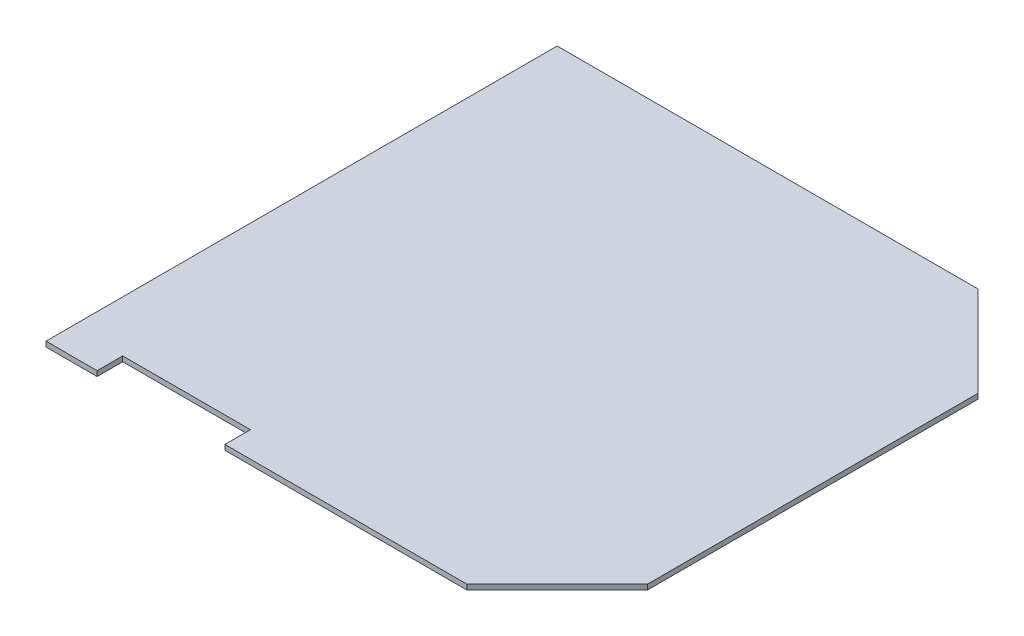
ISO-10303-21;
HEADER;
FILE_DESCRIPTION(('STEP AP214'),'2;1');
FILE_NAME('part.step','',(''),(''),'','','');
FILE_SCHEMA(('AUTOMOTIVE_DESIGN { 1 0 10303 214 1 1 1 1 }'));
ENDSEC;
DATA;
#1=APPLICATION_CONTEXT('core data for automotive mechanical design processes');
#2=APPLICATION_PROTOCOL_DEFINITION('international standard','automotive_design',2000,#1);
#3=PRODUCT_CONTEXT('',#1,'mechanical');
#4=PRODUCT('Part','Part','',(#3));
#5=PRODUCT_RELATED_PRODUCT_CATEGORY('part','',(#4));
#6=PRODUCT_DEFINITION_FORMATION('','',#4);
#7=PRODUCT_DEFINITION_CONTEXT('part definition',#1,'design');
#8=PRODUCT_DEFINITION('design','',#6,#7);
#9=PRODUCT_DEFINITION_SHAPE('','',#8);
#10=(LENGTH_UNIT() NAMED_UNIT(*) SI_UNIT(.MILLI.,.METRE.));
#11=(NAMED_UNIT(*) PLANE_ANGLE_UNIT() SI_UNIT($,.RADIAN.));
#12=(NAMED_UNIT(*) SI_UNIT($,.STERADIAN.) SOLID_ANGLE_UNIT());
#13=UNCERTAINTY_MEASURE_WITH_UNIT(LENGTH_MEASURE(1.E-05),#10,'distance_accuracy_value','');
#14=(GEOMETRIC_REPRESENTATION_CONTEXT(3) GLOBAL_UNCERTAINTY_ASSIGNED_CONTEXT((#13)) GLOBAL_UNIT_ASSIGNED_CONTEXT((#10,
#11,#12)) REPRESENTATION_CONTEXT('',''));
#15=CARTESIAN_POINT('',(0.,0.,0.));
#16=DIRECTION('',(0.,0.,1.));
#17=DIRECTION('',(1.,0.,0.));
#18=AXIS2_PLACEMENT_3D('',#15,#16,#17);
#19=CARTESIAN_POINT('',(-82.3223304703363,2.,100.));
#20=DIRECTION('',(0.,0.,-1.));
#21=DIRECTION('',(-1.,0.,0.));
#22=AXIS2_PLACEMENT_3D('',#19,#20,#21);
#23=PLANE('',#22);
#24=DIRECTION('',(1.,0.,0.));
#25=VECTOR('',#24,1.);
#26=CARTESIAN_POINT('',(-82.3223304703363,0.,100.));
#27=LINE('',#26,#25);
#28=CARTESIAN_POINT('',(-82.3223304703363,0.,100.));
#29=VERTEX_POINT('',#28);
#30=CARTESIAN_POINT('',(-62.3223304703363,0.,100.));
#31=VERTEX_POINT('',#30);
#32=EDGE_CURVE('E135',#29,#31,#27,.T.);
#33=ORIENTED_EDGE('',*,*,#32,.T.);
#34=DIRECTION('',(0.,1.,0.));
#35=VECTOR('',#34,1.);
#36=CARTESIAN_POINT('',(-62.3223304703363,0.,100.));
#37=LINE('',#36,#35);
#38=CARTESIAN_POINT('',(-62.3223304703363,2.,100.));
#39=VERTEX_POINT('',#38);
#40=EDGE_CURVE('E190',#31,#39,#37,.T.);
#41=ORIENTED_EDGE('',*,*,#40,.T.);
#42=DIRECTION('',(1.,0.,0.));
#43=VECTOR('',#42,1.);
#44=CARTESIAN_POINT('',(-82.3223304703363,2.,100.));
#45=LINE('',#44,#43);
#46=CARTESIAN_POINT('',(-82.3223304703363,2.,100.));
#47=VERTEX_POINT('',#46);
#48=EDGE_CURVE('E92',#47,#39,#45,.T.);
#49=ORIENTED_EDGE('',*,*,#48,.F.);
#50=DIRECTION('',(0.,-1.,0.));
#51=VECTOR('',#50,1.);
#52=CARTESIAN_POINT('',(-82.3223304703363,2.,100.));
#53=LINE('',#52,#51);
#54=EDGE_CURVE('E11',#47,#29,#53,.T.);
#55=ORIENTED_EDGE('',*,*,#54,.T.);
#56=EDGE_LOOP('',(#33,#41,#49,#55));
#57=FACE_BOUND('',#56,.T.);
#58=ADVANCED_FACE('F33',(#57),#23,.F.);
#59=CARTESIAN_POINT('',(-82.3223304703363,2.,100.));
#60=DIRECTION('',(1.,0.,0.));
#61=DIRECTION('',(0.,0.,-1.));
#62=AXIS2_PLACEMENT_3D('',#59,#60,#61);
#63=PLANE('',#62);
#64=DIRECTION('',(0.,0.,1.));
#65=VECTOR('',#64,1.);
#66=CARTESIAN_POINT('',(-82.3223304703363,0.,100.));
#67=LINE('',#66,#65);
#68=CARTESIAN_POINT('',(-82.3223304703363,0.,-100.));
#69=VERTEX_POINT('',#68);
#70=EDGE_CURVE('E130',#69,#29,#67,.T.);
#71=ORIENTED_EDGE('',*,*,#70,.T.);
#72=ORIENTED_EDGE('',*,*,#54,.F.);
#73=DIRECTION('',(0.,0.,1.));
#74=VECTOR('',#73,1.);
#75=CARTESIAN_POINT('',(-82.3223304703363,2.,100.));
#76=LINE('',#75,#74);
#77=CARTESIAN_POINT('',(-82.3223304703363,2.,-100.));
#78=VERTEX_POINT('',#77);
#79=EDGE_CURVE('E144',#78,#47,#76,.T.);
#80=ORIENTED_EDGE('',*,*,#79,.F.);
#81=DIRECTION('',(0.,-1.,0.));
#82=VECTOR('',#81,1.);
#83=CARTESIAN_POINT('',(-82.3223304703363,2.,-100.));
#84=LINE('',#83,#82);
#85=EDGE_CURVE('E126',#78,#69,#84,.T.);
#86=ORIENTED_EDGE('',*,*,#85,.T.);
#87=EDGE_LOOP('',(#71,#72,#80,#86));
#88=FACE_BOUND('',#87,.T.);
#89=ADVANCED_FACE('F35',(#88),#63,.F.);
#90=CARTESIAN_POINT('',(-12.3223304703363,2.,100.));
#91=VERTEX_POINT('',#90);
#92=CARTESIAN_POINT('',(82.3223304703364,2.,100.));
#93=VERTEX_POINT('',#92);
#94=EDGE_CURVE('E165',#91,#93,#45,.T.);
#95=ORIENTED_EDGE('',*,*,#94,.F.);
#96=DIRECTION('',(0.,1.,0.));
#97=VECTOR('',#96,1.);
#98=CARTESIAN_POINT('',(-12.3223304703363,0.,100.));
#99=LINE('',#98,#97);
#100=CARTESIAN_POINT('',(-12.3223304703363,0.,100.));
#101=VERTEX_POINT('',#100);
#102=EDGE_CURVE('E193',#101,#91,#99,.T.);
#103=ORIENTED_EDGE('',*,*,#102,.F.);
#104=CARTESIAN_POINT('',(82.3223304703364,0.,100.));
#105=VERTEX_POINT('',#104);
#106=EDGE_CURVE('E133',#101,#105,#27,.T.);
#107=ORIENTED_EDGE('',*,*,#106,.T.);
#108=DIRECTION('',(0.,-1.,0.));
#109=VECTOR('',#108,1.);
#110=CARTESIAN_POINT('',(82.3223304703364,2.,100.));
#111=LINE('',#110,#109);
#112=EDGE_CURVE('E41',#93,#105,#111,.T.);
#113=ORIENTED_EDGE('',*,*,#112,.F.);
#114=EDGE_LOOP('',(#95,#103,#107,#113));
#115=FACE_BOUND('',#114,.T.);
#116=ADVANCED_FACE('F198',(#115),#23,.F.);
#117=CARTESIAN_POINT('',(117.677669529664,2.,64.6446609406727));
#118=DIRECTION('',(-0.707106781186547,0.,-0.707106781186549));
#119=DIRECTION('',(-0.707106781186549,0.,0.707106781186546));
#120=AXIS2_PLACEMENT_3D('',#117,#118,#119);
#121=PLANE('',#120);
#122=DIRECTION('',(0.707106781186548,0.,-0.707106781186546));
#123=VECTOR('',#122,1.);
#124=CARTESIAN_POINT('',(117.677669529664,0.,64.6446609406727));
#125=LINE('',#124,#123);
#126=CARTESIAN_POINT('',(117.677669529664,0.,64.6446609406727));
#127=VERTEX_POINT('',#126);
#128=EDGE_CURVE('E138',#105,#127,#125,.T.);
#129=ORIENTED_EDGE('',*,*,#128,.T.);
#130=DIRECTION('',(0.,-1.,0.));
#131=VECTOR('',#130,1.);
#132=CARTESIAN_POINT('',(117.677669529664,2.,64.6446609406727));
#133=LINE('',#132,#131);
#134=CARTESIAN_POINT('',(117.677669529664,2.,64.6446609406727));
#135=VERTEX_POINT('',#134);
#136=EDGE_CURVE('E121',#135,#127,#133,.T.);
#137=ORIENTED_EDGE('',*,*,#136,.F.);
#138=DIRECTION('',(0.707106781186548,0.,-0.707106781186546));
#139=VECTOR('',#138,1.);
#140=CARTESIAN_POINT('',(117.677669529664,2.,64.6446609406727));
#141=LINE('',#140,#139);
#142=EDGE_CURVE('E109',#93,#135,#141,.T.);
#143=ORIENTED_EDGE('',*,*,#142,.F.);
#144=ORIENTED_EDGE('',*,*,#112,.T.);
#145=EDGE_LOOP('',(#129,#137,#143,#144));
#146=FACE_BOUND('',#145,.T.);
#147=ADVANCED_FACE('F151',(#146),#121,.F.);
#148=CARTESIAN_POINT('',(117.677669529664,2.,-64.6446609406727));
#149=DIRECTION('',(-1.,0.,0.));
#150=DIRECTION('',(0.,0.,1.));
#151=AXIS2_PLACEMENT_3D('',#148,#149,#150);
#152=PLANE('',#151);
#153=DIRECTION('',(0.,0.,-1.));
#154=VECTOR('',#153,1.);
#155=CARTESIAN_POINT('',(117.677669529664,0.,-64.6446609406727));
#156=LINE('',#155,#154);
#157=CARTESIAN_POINT('',(117.677669529664,0.,-64.6446609406727));
#158=VERTEX_POINT('',#157);
#159=EDGE_CURVE('E118',#127,#158,#156,.T.);
#160=ORIENTED_EDGE('',*,*,#159,.T.);
#161=DIRECTION('',(0.,-1.,0.));
#162=VECTOR('',#161,1.);
#163=CARTESIAN_POINT('',(117.677669529664,2.,-64.6446609406727));
#164=LINE('',#163,#162);
#165=CARTESIAN_POINT('',(117.677669529664,2.,-64.6446609406727));
#166=VERTEX_POINT('',#165);
#167=EDGE_CURVE('E115',#166,#158,#164,.T.);
#168=ORIENTED_EDGE('',*,*,#167,.F.);
#169=DIRECTION('',(0.,0.,-1.));
#170=VECTOR('',#169,1.);
#171=CARTESIAN_POINT('',(117.677669529664,2.,-64.6446609406727));
#172=LINE('',#171,#170);
#173=EDGE_CURVE('E102',#135,#166,#172,.T.);
#174=ORIENTED_EDGE('',*,*,#173,.F.);
#175=ORIENTED_EDGE('',*,*,#136,.T.);
#176=EDGE_LOOP('',(#160,#168,#174,#175));
#177=FACE_BOUND('',#176,.T.);
#178=ADVANCED_FACE('F116',(#177),#152,.F.);
#179=CARTESIAN_POINT('',(82.3223304703363,2.,-100.));
#180=DIRECTION('',(-0.707106781186546,0.,0.707106781186549));
#181=DIRECTION('',(0.707106781186549,0.,0.707106781186546));
#182=AXIS2_PLACEMENT_3D('',#179,#180,#181);
#183=PLANE('',#182);
#184=DIRECTION('',(-0.707106781186549,0.,-0.707106781186546));
#185=VECTOR('',#184,1.);
#186=CARTESIAN_POINT('',(82.3223304703363,0.,-100.));
#187=LINE('',#186,#185);
#188=CARTESIAN_POINT('',(82.3223304703363,0.,-100.));
#189=VERTEX_POINT('',#188);
#190=EDGE_CURVE('E141',#158,#189,#187,.T.);
#191=ORIENTED_EDGE('',*,*,#190,.T.);
#192=DIRECTION('',(0.,-1.,0.));
#193=VECTOR('',#192,1.);
#194=CARTESIAN_POINT('',(82.3223304703363,2.,-100.));
#195=LINE('',#194,#193);
#196=CARTESIAN_POINT('',(82.3223304703363,2.,-100.));
#197=VERTEX_POINT('',#196);
#198=EDGE_CURVE('E122',#197,#189,#195,.T.);
#199=ORIENTED_EDGE('',*,*,#198,.F.);
#200=DIRECTION('',(-0.707106781186549,0.,-0.707106781186546));
#201=VECTOR('',#200,1.);
#202=CARTESIAN_POINT('',(82.3223304703363,2.,-100.));
#203=LINE('',#202,#201);
#204=EDGE_CURVE('E106',#166,#197,#203,.T.);
#205=ORIENTED_EDGE('',*,*,#204,.F.);
#206=ORIENTED_EDGE('',*,*,#167,.T.);
#207=EDGE_LOOP('',(#191,#199,#205,#206));
#208=FACE_BOUND('',#207,.T.);
#209=ADVANCED_FACE('F124',(#208),#183,.F.);
#210=CARTESIAN_POINT('',(-82.3223304703363,2.,-100.));
#211=DIRECTION('',(0.,0.,1.));
#212=DIRECTION('',(1.,0.,0.));
#213=AXIS2_PLACEMENT_3D('',#210,#211,#212);
#214=PLANE('',#213);
#215=DIRECTION('',(-1.,0.,0.));
#216=VECTOR('',#215,1.);
#217=CARTESIAN_POINT('',(-82.3223304703363,0.,-100.));
#218=LINE('',#217,#216);
#219=EDGE_CURVE('E84',#189,#69,#218,.T.);
#220=ORIENTED_EDGE('',*,*,#219,.T.);
#221=ORIENTED_EDGE('',*,*,#85,.F.);
#222=DIRECTION('',(-1.,0.,0.));
#223=VECTOR('',#222,1.);
#224=CARTESIAN_POINT('',(-82.3223304703363,2.,-100.));
#225=LINE('',#224,#223);
#226=EDGE_CURVE('E57',#197,#78,#225,.T.);
#227=ORIENTED_EDGE('',*,*,#226,.F.);
#228=ORIENTED_EDGE('',*,*,#198,.T.);
#229=EDGE_LOOP('',(#220,#221,#227,#228));
#230=FACE_BOUND('',#229,.T.);
#231=ADVANCED_FACE('F161',(#230),#214,.F.);
#232=CARTESIAN_POINT('',(0.,2.,0.));
#233=DIRECTION('',(0.,-1.,0.));
#234=DIRECTION('',(0.,0.,-1.));
#235=AXIS2_PLACEMENT_3D('',#232,#233,#234);
#236=PLANE('',#235);
#237=ORIENTED_EDGE('',*,*,#48,.T.);
#238=DIRECTION('',(0.,0.,-1.));
#239=VECTOR('',#238,1.);
#240=CARTESIAN_POINT('',(-62.3223304703363,2.,0.));
#241=LINE('',#240,#239);
#242=CARTESIAN_POINT('',(-62.3223304703363,2.,90.));
#243=VERTEX_POINT('',#242);
#244=EDGE_CURVE('E134',#39,#243,#241,.T.);
#245=ORIENTED_EDGE('',*,*,#244,.T.);
#246=DIRECTION('',(1.,0.,0.));
#247=VECTOR('',#246,1.);
#248=CARTESIAN_POINT('',(0.,2.,90.));
#249=LINE('',#248,#247);
#250=CARTESIAN_POINT('',(-12.3223304703363,2.,90.));
#251=VERTEX_POINT('',#250);
#252=EDGE_CURVE('E211',#243,#251,#249,.T.);
#253=ORIENTED_EDGE('',*,*,#252,.T.);
#254=DIRECTION('',(0.,0.,1.));
#255=VECTOR('',#254,1.);
#256=CARTESIAN_POINT('',(-12.3223304703363,2.,0.));
#257=LINE('',#256,#255);
#258=EDGE_CURVE('E209',#251,#91,#257,.T.);
#259=ORIENTED_EDGE('',*,*,#258,.T.);
#260=ORIENTED_EDGE('',*,*,#94,.T.);
#261=ORIENTED_EDGE('',*,*,#142,.T.);
#262=ORIENTED_EDGE('',*,*,#173,.T.);
#263=ORIENTED_EDGE('',*,*,#204,.T.);
#264=ORIENTED_EDGE('',*,*,#226,.T.);
#265=ORIENTED_EDGE('',*,*,#79,.T.);
#266=EDGE_LOOP('',(#237,#245,#253,#259,#260,#261,#262,#263,#264,#265));
#267=FACE_BOUND('',#266,.T.);
#268=ADVANCED_FACE('F104',(#267),#236,.F.);
#269=CARTESIAN_POINT('',(0.,0.,0.));
#270=DIRECTION('',(0.,-1.,0.));
#271=DIRECTION('',(0.,0.,-1.));
#272=AXIS2_PLACEMENT_3D('',#269,#270,#271);
#273=PLANE('',#272);
#274=DIRECTION('',(0.,0.,1.));
#275=VECTOR('',#274,1.);
#276=CARTESIAN_POINT('',(-62.3223304703363,0.,100.));
#277=LINE('',#276,#275);
#278=CARTESIAN_POINT('',(-62.3223304703363,0.,90.));
#279=VERTEX_POINT('',#278);
#280=EDGE_CURVE('E192',#279,#31,#277,.T.);
#281=ORIENTED_EDGE('',*,*,#280,.T.);
#282=ORIENTED_EDGE('',*,*,#32,.F.);
#283=ORIENTED_EDGE('',*,*,#70,.F.);
#284=ORIENTED_EDGE('',*,*,#219,.F.);
#285=ORIENTED_EDGE('',*,*,#190,.F.);
#286=ORIENTED_EDGE('',*,*,#159,.F.);
#287=ORIENTED_EDGE('',*,*,#128,.F.);
#288=ORIENTED_EDGE('',*,*,#106,.F.);
#289=DIRECTION('',(0.,0.,-1.));
#290=VECTOR('',#289,1.);
#291=CARTESIAN_POINT('',(-12.3223304703363,0.,100.));
#292=LINE('',#291,#290);
#293=CARTESIAN_POINT('',(-12.3223304703363,0.,90.));
#294=VERTEX_POINT('',#293);
#295=EDGE_CURVE('E195',#101,#294,#292,.T.);
#296=ORIENTED_EDGE('',*,*,#295,.T.);
#297=DIRECTION('',(-1.,0.,0.));
#298=VECTOR('',#297,1.);
#299=CARTESIAN_POINT('',(-62.3223304703363,0.,90.));
#300=LINE('',#299,#298);
#301=EDGE_CURVE('E48',#294,#279,#300,.T.);
#302=ORIENTED_EDGE('',*,*,#301,.T.);
#303=EDGE_LOOP('',(#281,#282,#283,#284,#285,#286,#287,#288,#296,#302));
#304=FACE_BOUND('',#303,.T.);
#305=ADVANCED_FACE('F157',(#304),#273,.T.);
#306=CARTESIAN_POINT('',(-62.3223304703363,0.,100.));
#307=DIRECTION('',(-1.,0.,0.));
#308=DIRECTION('',(0.,0.,1.));
#309=AXIS2_PLACEMENT_3D('',#306,#307,#308);
#310=PLANE('',#309);
#311=ORIENTED_EDGE('',*,*,#40,.F.);
#312=ORIENTED_EDGE('',*,*,#280,.F.);
#313=DIRECTION('',(0.,1.,0.));
#314=VECTOR('',#313,1.);
#315=CARTESIAN_POINT('',(-62.3223304703363,0.,90.));
#316=LINE('',#315,#314);
#317=EDGE_CURVE('E213',#279,#243,#316,.T.);
#318=ORIENTED_EDGE('',*,*,#317,.T.);
#319=ORIENTED_EDGE('',*,*,#244,.F.);
#320=EDGE_LOOP('',(#311,#312,#318,#319));
#321=FACE_BOUND('',#320,.T.);
#322=ADVANCED_FACE('F191',(#321),#310,.F.);
#323=CARTESIAN_POINT('',(-62.3223304703363,0.,90.));
#324=DIRECTION('',(0.,0.,-1.));
#325=DIRECTION('',(-1.,0.,0.));
#326=AXIS2_PLACEMENT_3D('',#323,#324,#325);
#327=PLANE('',#326);
#328=ORIENTED_EDGE('',*,*,#317,.F.);
#329=ORIENTED_EDGE('',*,*,#301,.F.);
#330=DIRECTION('',(0.,1.,0.));
#331=VECTOR('',#330,1.);
#332=CARTESIAN_POINT('',(-12.3223304703363,0.,90.));
#333=LINE('',#332,#331);
#334=EDGE_CURVE('E215',#294,#251,#333,.T.);
#335=ORIENTED_EDGE('',*,*,#334,.T.);
#336=ORIENTED_EDGE('',*,*,#252,.F.);
#337=EDGE_LOOP('',(#328,#329,#335,#336));
#338=FACE_BOUND('',#337,.T.);
#339=ADVANCED_FACE('F222',(#338),#327,.F.);
#340=CARTESIAN_POINT('',(-12.3223304703363,0.,100.));
#341=DIRECTION('',(1.,0.,0.));
#342=DIRECTION('',(0.,0.,-1.));
#343=AXIS2_PLACEMENT_3D('',#340,#341,#342);
#344=PLANE('',#343);
#345=ORIENTED_EDGE('',*,*,#334,.F.);
#346=ORIENTED_EDGE('',*,*,#295,.F.);
#347=ORIENTED_EDGE('',*,*,#102,.T.);
#348=ORIENTED_EDGE('',*,*,#258,.F.);
#349=EDGE_LOOP('',(#345,#346,#347,#348));
#350=FACE_BOUND('',#349,.T.);
#351=ADVANCED_FACE('F221',(#350),#344,.F.);
#352=CLOSED_SHELL('',(#58,#89,#116,#147,#178,#209,#231,#268,#305,#322,#339,#351));
#353=MANIFOLD_SOLID_BREP('B2',#352);
#354=ADVANCED_BREP_SHAPE_REPRESENTATION('',(#18,#353),#14);
#355=SHAPE_DEFINITION_REPRESENTATION(#9,#354);
ENDSEC;
END-ISO-10303-21;
